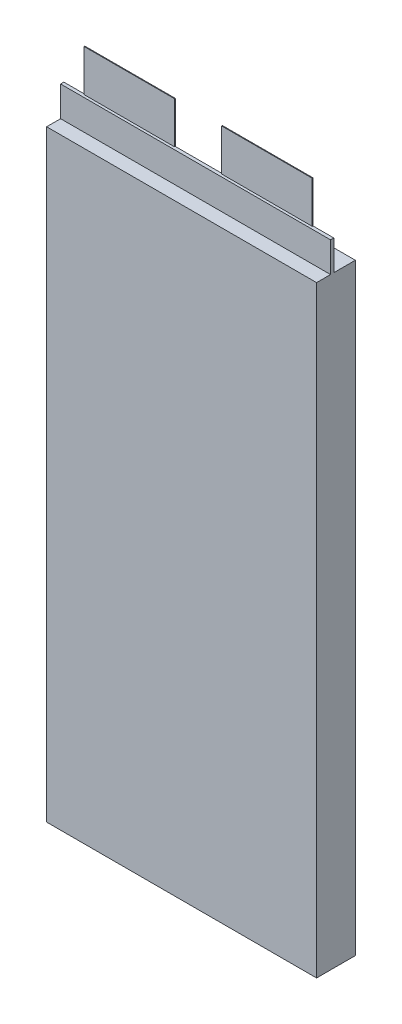
ISO-10303-21;
HEADER;
FILE_DESCRIPTION(('STEP AP214'),'2;1');
FILE_NAME('part.step','',(''),(''),'','','');
FILE_SCHEMA(('AUTOMOTIVE_DESIGN { 1 0 10303 214 1 1 1 1 }'));
ENDSEC;
DATA;
#1=APPLICATION_CONTEXT('core data for automotive mechanical design processes');
#2=APPLICATION_PROTOCOL_DEFINITION('international standard','automotive_design',2000,#1);
#3=PRODUCT_CONTEXT('',#1,'mechanical');
#4=PRODUCT('Part','Part','',(#3));
#5=PRODUCT_RELATED_PRODUCT_CATEGORY('part','',(#4));
#6=PRODUCT_DEFINITION_FORMATION('','',#4);
#7=PRODUCT_DEFINITION_CONTEXT('part definition',#1,'design');
#8=PRODUCT_DEFINITION('design','',#6,#7);
#9=PRODUCT_DEFINITION_SHAPE('','',#8);
#10=(LENGTH_UNIT() NAMED_UNIT(*) SI_UNIT(.MILLI.,.METRE.));
#11=(NAMED_UNIT(*) PLANE_ANGLE_UNIT() SI_UNIT($,.RADIAN.));
#12=(NAMED_UNIT(*) SI_UNIT($,.STERADIAN.) SOLID_ANGLE_UNIT());
#13=UNCERTAINTY_MEASURE_WITH_UNIT(LENGTH_MEASURE(1.E-05),#10,'distance_accuracy_value','');
#14=(GEOMETRIC_REPRESENTATION_CONTEXT(3) GLOBAL_UNCERTAINTY_ASSIGNED_CONTEXT((#13)) GLOBAL_UNIT_ASSIGNED_CONTEXT((#10,
#11,#12)) REPRESENTATION_CONTEXT('',''));
#15=CARTESIAN_POINT('',(0.,0.,0.));
#16=DIRECTION('',(0.,0.,1.));
#17=DIRECTION('',(1.,0.,0.));
#18=AXIS2_PLACEMENT_3D('',#15,#16,#17);
#19=CARTESIAN_POINT('',(0.,174.5,6.15));
#20=DIRECTION('',(0.,1.,0.));
#21=DIRECTION('',(0.,0.,1.));
#22=AXIS2_PLACEMENT_3D('',#19,#20,#21);
#23=PLANE('',#22);
#24=DIRECTION('',(1.,0.,0.));
#25=VECTOR('',#24,1.);
#26=CARTESIAN_POINT('',(0.,174.5,5.95));
#27=LINE('',#26,#25);
#28=CARTESIAN_POINT('',(6.49999999999999,174.5,5.95));
#29=VERTEX_POINT('',#28);
#30=CARTESIAN_POINT('',(31.5,174.5,5.95));
#31=VERTEX_POINT('',#30);
#32=EDGE_CURVE('E109',#29,#31,#27,.T.);
#33=ORIENTED_EDGE('',*,*,#32,.T.);
#34=DIRECTION('',(0.,0.,-1.));
#35=VECTOR('',#34,1.);
#36=CARTESIAN_POINT('',(31.5,174.5,6.15));
#37=LINE('',#36,#35);
#38=CARTESIAN_POINT('',(31.5,174.5,6.15));
#39=VERTEX_POINT('',#38);
#40=EDGE_CURVE('E12',#39,#31,#37,.T.);
#41=ORIENTED_EDGE('',*,*,#40,.F.);
#42=DIRECTION('',(1.,0.,0.));
#43=VECTOR('',#42,1.);
#44=CARTESIAN_POINT('',(0.,174.5,6.15));
#45=LINE('',#44,#43);
#46=CARTESIAN_POINT('',(6.49999999999999,174.5,6.15));
#47=VERTEX_POINT('',#46);
#48=EDGE_CURVE('E95',#47,#39,#45,.T.);
#49=ORIENTED_EDGE('',*,*,#48,.F.);
#50=DIRECTION('',(0.,0.,-1.));
#51=VECTOR('',#50,1.);
#52=CARTESIAN_POINT('',(6.49999999999999,174.5,6.15));
#53=LINE('',#52,#51);
#54=EDGE_CURVE('E62',#47,#29,#53,.T.);
#55=ORIENTED_EDGE('',*,*,#54,.T.);
#56=EDGE_LOOP('',(#33,#41,#49,#55));
#57=FACE_BOUND('',#56,.T.);
#58=ADVANCED_FACE('F46',(#57),#23,.F.);
#59=CARTESIAN_POINT('',(31.5000000000001,0.,6.15));
#60=DIRECTION('',(-1.,0.,0.));
#61=DIRECTION('',(0.,-1.,0.));
#62=AXIS2_PLACEMENT_3D('',#59,#60,#61);
#63=PLANE('',#62);
#64=DIRECTION('',(0.,1.,0.));
#65=VECTOR('',#64,1.);
#66=CARTESIAN_POINT('',(31.5000000000001,0.,5.95));
#67=LINE('',#66,#65);
#68=CARTESIAN_POINT('',(31.5,186.,5.95));
#69=VERTEX_POINT('',#68);
#70=EDGE_CURVE('E100',#31,#69,#67,.T.);
#71=ORIENTED_EDGE('',*,*,#70,.T.);
#72=DIRECTION('',(0.,0.,-1.));
#73=VECTOR('',#72,1.);
#74=CARTESIAN_POINT('',(31.5,186.,6.15));
#75=LINE('',#74,#73);
#76=CARTESIAN_POINT('',(31.5,186.,6.15));
#77=VERTEX_POINT('',#76);
#78=EDGE_CURVE('E54',#77,#69,#75,.T.);
#79=ORIENTED_EDGE('',*,*,#78,.F.);
#80=DIRECTION('',(0.,1.,0.));
#81=VECTOR('',#80,1.);
#82=CARTESIAN_POINT('',(31.5000000000001,0.,6.15));
#83=LINE('',#82,#81);
#84=EDGE_CURVE('E87',#39,#77,#83,.T.);
#85=ORIENTED_EDGE('',*,*,#84,.F.);
#86=ORIENTED_EDGE('',*,*,#40,.T.);
#87=EDGE_LOOP('',(#71,#79,#85,#86));
#88=FACE_BOUND('',#87,.T.);
#89=ADVANCED_FACE('F99',(#88),#63,.F.);
#90=CARTESIAN_POINT('',(0.,186.,6.15));
#91=DIRECTION('',(0.,1.,0.));
#92=DIRECTION('',(0.,0.,1.));
#93=AXIS2_PLACEMENT_3D('',#90,#91,#92);
#94=PLANE('',#93);
#95=DIRECTION('',(1.,0.,0.));
#96=VECTOR('',#95,1.);
#97=CARTESIAN_POINT('',(0.,186.,5.95));
#98=LINE('',#97,#96);
#99=CARTESIAN_POINT('',(6.49999999999999,186.,5.95));
#100=VERTEX_POINT('',#99);
#101=EDGE_CURVE('E112',#100,#69,#98,.T.);
#102=ORIENTED_EDGE('',*,*,#101,.F.);
#103=DIRECTION('',(0.,0.,-1.));
#104=VECTOR('',#103,1.);
#105=CARTESIAN_POINT('',(6.49999999999999,186.,6.15));
#106=LINE('',#105,#104);
#107=CARTESIAN_POINT('',(6.49999999999999,186.,6.15));
#108=VERTEX_POINT('',#107);
#109=EDGE_CURVE('E76',#108,#100,#106,.T.);
#110=ORIENTED_EDGE('',*,*,#109,.F.);
#111=DIRECTION('',(1.,0.,0.));
#112=VECTOR('',#111,1.);
#113=CARTESIAN_POINT('',(0.,186.,6.15));
#114=LINE('',#113,#112);
#115=EDGE_CURVE('E94',#108,#77,#114,.T.);
#116=ORIENTED_EDGE('',*,*,#115,.T.);
#117=ORIENTED_EDGE('',*,*,#78,.T.);
#118=EDGE_LOOP('',(#102,#110,#116,#117));
#119=FACE_BOUND('',#118,.T.);
#120=ADVANCED_FACE('F103',(#119),#94,.T.);
#121=CARTESIAN_POINT('',(6.49999999999992,0.,6.15));
#122=DIRECTION('',(-1.,0.,0.));
#123=DIRECTION('',(0.,-1.,0.));
#124=AXIS2_PLACEMENT_3D('',#121,#122,#123);
#125=PLANE('',#124);
#126=DIRECTION('',(0.,1.,0.));
#127=VECTOR('',#126,1.);
#128=CARTESIAN_POINT('',(6.49999999999992,0.,5.95));
#129=LINE('',#128,#127);
#130=EDGE_CURVE('E114',#29,#100,#129,.T.);
#131=ORIENTED_EDGE('',*,*,#130,.F.);
#132=ORIENTED_EDGE('',*,*,#54,.F.);
#133=DIRECTION('',(0.,1.,0.));
#134=VECTOR('',#133,1.);
#135=CARTESIAN_POINT('',(6.49999999999992,0.,6.15));
#136=LINE('',#135,#134);
#137=EDGE_CURVE('E104',#47,#108,#136,.T.);
#138=ORIENTED_EDGE('',*,*,#137,.T.);
#139=ORIENTED_EDGE('',*,*,#109,.T.);
#140=EDGE_LOOP('',(#131,#132,#138,#139));
#141=FACE_BOUND('',#140,.T.);
#142=ADVANCED_FACE('F120',(#141),#125,.T.);
#143=CARTESIAN_POINT('',(0.,0.,6.15));
#144=DIRECTION('',(0.,0.,1.));
#145=DIRECTION('',(1.,0.,0.));
#146=AXIS2_PLACEMENT_3D('',#143,#144,#145);
#147=PLANE('',#146);
#148=ORIENTED_EDGE('',*,*,#48,.T.);
#149=ORIENTED_EDGE('',*,*,#84,.T.);
#150=ORIENTED_EDGE('',*,*,#115,.F.);
#151=ORIENTED_EDGE('',*,*,#137,.F.);
#152=EDGE_LOOP('',(#148,#149,#150,#151));
#153=FACE_BOUND('',#152,.T.);
#154=ADVANCED_FACE('F91',(#153),#147,.T.);
#155=CARTESIAN_POINT('',(0.,0.,5.95));
#156=DIRECTION('',(0.,0.,1.));
#157=DIRECTION('',(1.,0.,0.));
#158=AXIS2_PLACEMENT_3D('',#155,#156,#157);
#159=PLANE('',#158);
#160=ORIENTED_EDGE('',*,*,#32,.F.);
#161=ORIENTED_EDGE('',*,*,#130,.T.);
#162=ORIENTED_EDGE('',*,*,#101,.T.);
#163=ORIENTED_EDGE('',*,*,#70,.F.);
#164=EDGE_LOOP('',(#160,#161,#162,#163));
#165=FACE_BOUND('',#164,.T.);
#166=ADVANCED_FACE('F119',(#165),#159,.F.);
#167=CLOSED_SHELL('',(#58,#89,#120,#142,#154,#166));
#168=MANIFOLD_SOLID_BREP('B2',#167);
#169=CARTESIAN_POINT('',(0.,174.5,6.15));
#170=DIRECTION('',(0.,1.,0.));
#171=DIRECTION('',(0.,0.,1.));
#172=AXIS2_PLACEMENT_3D('',#169,#170,#171);
#173=PLANE('',#172);
#174=DIRECTION('',(1.,0.,0.));
#175=VECTOR('',#174,1.);
#176=CARTESIAN_POINT('',(0.,174.5,5.95));
#177=LINE('',#176,#175);
#178=CARTESIAN_POINT('',(-31.5,174.5,5.95));
#179=VERTEX_POINT('',#178);
#180=CARTESIAN_POINT('',(-6.5,174.5,5.95));
#181=VERTEX_POINT('',#180);
#182=EDGE_CURVE('E242',#179,#181,#177,.T.);
#183=ORIENTED_EDGE('',*,*,#182,.T.);
#184=DIRECTION('',(0.,0.,-1.));
#185=VECTOR('',#184,1.);
#186=CARTESIAN_POINT('',(-6.5,174.5,6.15));
#187=LINE('',#186,#185);
#188=CARTESIAN_POINT('',(-6.5,174.5,6.15));
#189=VERTEX_POINT('',#188);
#190=EDGE_CURVE('E44',#189,#181,#187,.T.);
#191=ORIENTED_EDGE('',*,*,#190,.F.);
#192=DIRECTION('',(1.,0.,0.));
#193=VECTOR('',#192,1.);
#194=CARTESIAN_POINT('',(0.,174.5,6.15));
#195=LINE('',#194,#193);
#196=CARTESIAN_POINT('',(-31.5,174.5,6.15));
#197=VERTEX_POINT('',#196);
#198=EDGE_CURVE('E228',#197,#189,#195,.T.);
#199=ORIENTED_EDGE('',*,*,#198,.F.);
#200=DIRECTION('',(0.,0.,-1.));
#201=VECTOR('',#200,1.);
#202=CARTESIAN_POINT('',(-31.5,174.5,6.15));
#203=LINE('',#202,#201);
#204=EDGE_CURVE('E195',#197,#179,#203,.T.);
#205=ORIENTED_EDGE('',*,*,#204,.T.);
#206=EDGE_LOOP('',(#183,#191,#199,#205));
#207=FACE_BOUND('',#206,.T.);
#208=ADVANCED_FACE('F179',(#207),#173,.F.);
#209=CARTESIAN_POINT('',(-6.49999999999995,0.,6.15));
#210=DIRECTION('',(-1.,0.,0.));
#211=DIRECTION('',(0.,-1.,0.));
#212=AXIS2_PLACEMENT_3D('',#209,#210,#211);
#213=PLANE('',#212);
#214=DIRECTION('',(0.,1.,0.));
#215=VECTOR('',#214,1.);
#216=CARTESIAN_POINT('',(-6.49999999999995,0.,5.95));
#217=LINE('',#216,#215);
#218=CARTESIAN_POINT('',(-6.50000000000001,186.,5.95));
#219=VERTEX_POINT('',#218);
#220=EDGE_CURVE('E233',#181,#219,#217,.T.);
#221=ORIENTED_EDGE('',*,*,#220,.T.);
#222=DIRECTION('',(0.,0.,-1.));
#223=VECTOR('',#222,1.);
#224=CARTESIAN_POINT('',(-6.50000000000001,186.,6.15));
#225=LINE('',#224,#223);
#226=CARTESIAN_POINT('',(-6.50000000000001,186.,6.15));
#227=VERTEX_POINT('',#226);
#228=EDGE_CURVE('E187',#227,#219,#225,.T.);
#229=ORIENTED_EDGE('',*,*,#228,.F.);
#230=DIRECTION('',(0.,1.,0.));
#231=VECTOR('',#230,1.);
#232=CARTESIAN_POINT('',(-6.49999999999995,0.,6.15));
#233=LINE('',#232,#231);
#234=EDGE_CURVE('E220',#189,#227,#233,.T.);
#235=ORIENTED_EDGE('',*,*,#234,.F.);
#236=ORIENTED_EDGE('',*,*,#190,.T.);
#237=EDGE_LOOP('',(#221,#229,#235,#236));
#238=FACE_BOUND('',#237,.T.);
#239=ADVANCED_FACE('F232',(#238),#213,.F.);
#240=CARTESIAN_POINT('',(0.,186.,6.15));
#241=DIRECTION('',(0.,1.,0.));
#242=DIRECTION('',(0.,0.,1.));
#243=AXIS2_PLACEMENT_3D('',#240,#241,#242);
#244=PLANE('',#243);
#245=DIRECTION('',(1.,0.,0.));
#246=VECTOR('',#245,1.);
#247=CARTESIAN_POINT('',(0.,186.,5.95));
#248=LINE('',#247,#246);
#249=CARTESIAN_POINT('',(-31.5,186.,5.95));
#250=VERTEX_POINT('',#249);
#251=EDGE_CURVE('E245',#250,#219,#248,.T.);
#252=ORIENTED_EDGE('',*,*,#251,.F.);
#253=DIRECTION('',(0.,0.,-1.));
#254=VECTOR('',#253,1.);
#255=CARTESIAN_POINT('',(-31.5,186.,6.15));
#256=LINE('',#255,#254);
#257=CARTESIAN_POINT('',(-31.5,186.,6.15));
#258=VERTEX_POINT('',#257);
#259=EDGE_CURVE('E209',#258,#250,#256,.T.);
#260=ORIENTED_EDGE('',*,*,#259,.F.);
#261=DIRECTION('',(1.,0.,0.));
#262=VECTOR('',#261,1.);
#263=CARTESIAN_POINT('',(0.,186.,6.15));
#264=LINE('',#263,#262);
#265=EDGE_CURVE('E227',#258,#227,#264,.T.);
#266=ORIENTED_EDGE('',*,*,#265,.T.);
#267=ORIENTED_EDGE('',*,*,#228,.T.);
#268=EDGE_LOOP('',(#252,#260,#266,#267));
#269=FACE_BOUND('',#268,.T.);
#270=ADVANCED_FACE('F236',(#269),#244,.T.);
#271=CARTESIAN_POINT('',(-31.5,0.,6.15));
#272=DIRECTION('',(-1.,0.,0.));
#273=DIRECTION('',(0.,0.,1.));
#274=AXIS2_PLACEMENT_3D('',#271,#272,#273);
#275=PLANE('',#274);
#276=DIRECTION('',(0.,1.,0.));
#277=VECTOR('',#276,1.);
#278=CARTESIAN_POINT('',(-31.5,0.,5.95));
#279=LINE('',#278,#277);
#280=EDGE_CURVE('E247',#179,#250,#279,.T.);
#281=ORIENTED_EDGE('',*,*,#280,.F.);
#282=ORIENTED_EDGE('',*,*,#204,.F.);
#283=DIRECTION('',(0.,1.,0.));
#284=VECTOR('',#283,1.);
#285=CARTESIAN_POINT('',(-31.5,0.,6.15));
#286=LINE('',#285,#284);
#287=EDGE_CURVE('E237',#197,#258,#286,.T.);
#288=ORIENTED_EDGE('',*,*,#287,.T.);
#289=ORIENTED_EDGE('',*,*,#259,.T.);
#290=EDGE_LOOP('',(#281,#282,#288,#289));
#291=FACE_BOUND('',#290,.T.);
#292=ADVANCED_FACE('F253',(#291),#275,.T.);
#293=CARTESIAN_POINT('',(0.,0.,6.15));
#294=DIRECTION('',(0.,0.,1.));
#295=DIRECTION('',(1.,0.,0.));
#296=AXIS2_PLACEMENT_3D('',#293,#294,#295);
#297=PLANE('',#296);
#298=ORIENTED_EDGE('',*,*,#198,.T.);
#299=ORIENTED_EDGE('',*,*,#234,.T.);
#300=ORIENTED_EDGE('',*,*,#265,.F.);
#301=ORIENTED_EDGE('',*,*,#287,.F.);
#302=EDGE_LOOP('',(#298,#299,#300,#301));
#303=FACE_BOUND('',#302,.T.);
#304=ADVANCED_FACE('F224',(#303),#297,.T.);
#305=CARTESIAN_POINT('',(0.,0.,5.95));
#306=DIRECTION('',(0.,0.,1.));
#307=DIRECTION('',(1.,0.,0.));
#308=AXIS2_PLACEMENT_3D('',#305,#306,#307);
#309=PLANE('',#308);
#310=ORIENTED_EDGE('',*,*,#182,.F.);
#311=ORIENTED_EDGE('',*,*,#280,.T.);
#312=ORIENTED_EDGE('',*,*,#251,.T.);
#313=ORIENTED_EDGE('',*,*,#220,.F.);
#314=EDGE_LOOP('',(#310,#311,#312,#313));
#315=FACE_BOUND('',#314,.T.);
#316=ADVANCED_FACE('F252',(#315),#309,.F.);
#317=CLOSED_SHELL('',(#208,#239,#270,#292,#304,#316));
#318=MANIFOLD_SOLID_BREP('B6',#317);
#319=CARTESIAN_POINT('',(-37.25,166.2,10.7));
#320=DIRECTION('',(0.,-1.,0.));
#321=DIRECTION('',(1.,0.,0.));
#322=AXIS2_PLACEMENT_3D('',#319,#320,#321);
#323=PLANE('',#322);
#324=DIRECTION('',(1.,0.,0.));
#325=VECTOR('',#324,1.);
#326=CARTESIAN_POINT('',(-37.25,166.2,6.85));
#327=LINE('',#326,#325);
#328=CARTESIAN_POINT('',(-37.25,166.2,6.85));
#329=VERTEX_POINT('',#328);
#330=CARTESIAN_POINT('',(37.2499999999999,166.2,6.85));
#331=VERTEX_POINT('',#330);
#332=EDGE_CURVE('E369',#329,#331,#327,.T.);
#333=ORIENTED_EDGE('',*,*,#332,.F.);
#334=DIRECTION('',(0.,0.,-1.));
#335=VECTOR('',#334,1.);
#336=CARTESIAN_POINT('',(-37.25,166.2,10.7));
#337=LINE('',#336,#335);
#338=CARTESIAN_POINT('',(-37.25,166.2,10.7));
#339=VERTEX_POINT('',#338);
#340=EDGE_CURVE('E424',#339,#329,#337,.T.);
#341=ORIENTED_EDGE('',*,*,#340,.F.);
#342=DIRECTION('',(-1.,0.,0.));
#343=VECTOR('',#342,1.);
#344=CARTESIAN_POINT('',(-37.25,166.2,10.7));
#345=LINE('',#344,#343);
#346=CARTESIAN_POINT('',(37.2499999999999,166.2,10.7));
#347=VERTEX_POINT('',#346);
#348=EDGE_CURVE('E371',#347,#339,#345,.T.);
#349=ORIENTED_EDGE('',*,*,#348,.F.);
#350=DIRECTION('',(0.,0.,-1.));
#351=VECTOR('',#350,1.);
#352=CARTESIAN_POINT('',(37.2499999999999,166.2,10.7));
#353=LINE('',#352,#351);
#354=EDGE_CURVE('E366',#347,#331,#353,.T.);
#355=ORIENTED_EDGE('',*,*,#354,.T.);
#356=EDGE_LOOP('',(#333,#341,#349,#355));
#357=FACE_BOUND('',#356,.T.);
#358=ADVANCED_FACE('F303',(#357),#323,.F.);
#359=CARTESIAN_POINT('',(-37.25,0.,10.7));
#360=DIRECTION('',(1.,0.,0.));
#361=DIRECTION('',(0.,0.,-1.));
#362=AXIS2_PLACEMENT_3D('',#359,#360,#361);
#363=PLANE('',#362);
#364=DIRECTION('',(0.,-1.,0.));
#365=VECTOR('',#364,1.);
#366=CARTESIAN_POINT('',(-37.25,0.,0.));
#367=LINE('',#366,#365);
#368=CARTESIAN_POINT('',(-37.25,166.2,0.));
#369=VERTEX_POINT('',#368);
#370=CARTESIAN_POINT('',(-37.25,0.,0.));
#371=VERTEX_POINT('',#370);
#372=EDGE_CURVE('E407',#369,#371,#367,.T.);
#373=ORIENTED_EDGE('',*,*,#372,.T.);
#374=DIRECTION('',(0.,0.,-1.));
#375=VECTOR('',#374,1.);
#376=CARTESIAN_POINT('',(-37.25,0.,10.7));
#377=LINE('',#376,#375);
#378=CARTESIAN_POINT('',(-37.25,0.,10.7));
#379=VERTEX_POINT('',#378);
#380=EDGE_CURVE('E177',#379,#371,#377,.T.);
#381=ORIENTED_EDGE('',*,*,#380,.F.);
#382=DIRECTION('',(0.,-1.,0.));
#383=VECTOR('',#382,1.);
#384=CARTESIAN_POINT('',(-37.25,0.,10.7));
#385=LINE('',#384,#383);
#386=EDGE_CURVE('E408',#339,#379,#385,.T.);
#387=ORIENTED_EDGE('',*,*,#386,.F.);
#388=ORIENTED_EDGE('',*,*,#340,.T.);
#389=DIRECTION('',(0.,-1.,0.));
#390=VECTOR('',#389,1.);
#391=CARTESIAN_POINT('',(-37.25,166.2,6.85));
#392=LINE('',#391,#390);
#393=CARTESIAN_POINT('',(-37.25,174.5,6.85));
#394=VERTEX_POINT('',#393);
#395=EDGE_CURVE('E383',#394,#329,#392,.T.);
#396=ORIENTED_EDGE('',*,*,#395,.F.);
#397=DIRECTION('',(0.,0.,-1.));
#398=VECTOR('',#397,1.);
#399=CARTESIAN_POINT('',(-37.25,174.5,6.85));
#400=LINE('',#399,#398);
#401=CARTESIAN_POINT('',(-37.25,174.5,5.95));
#402=VERTEX_POINT('',#401);
#403=EDGE_CURVE('E392',#394,#402,#400,.T.);
#404=ORIENTED_EDGE('',*,*,#403,.T.);
#405=DIRECTION('',(0.,-1.,0.));
#406=VECTOR('',#405,1.);
#407=CARTESIAN_POINT('',(-37.25,166.2,5.95));
#408=LINE('',#407,#406);
#409=CARTESIAN_POINT('',(-37.25,166.2,5.95));
#410=VERTEX_POINT('',#409);
#411=EDGE_CURVE('E396',#402,#410,#408,.T.);
#412=ORIENTED_EDGE('',*,*,#411,.T.);
#413=EDGE_CURVE('E323',#410,#369,#337,.T.);
#414=ORIENTED_EDGE('',*,*,#413,.T.);
#415=EDGE_LOOP('',(#373,#381,#387,#388,#396,#404,#412,#414));
#416=FACE_BOUND('',#415,.T.);
#417=ADVANCED_FACE('F305',(#416),#363,.F.);
#418=CARTESIAN_POINT('',(-37.25,0.,10.7));
#419=DIRECTION('',(0.,1.,0.));
#420=DIRECTION('',(-1.,0.,0.));
#421=AXIS2_PLACEMENT_3D('',#418,#419,#420);
#422=PLANE('',#421);
#423=DIRECTION('',(1.,0.,0.));
#424=VECTOR('',#423,1.);
#425=CARTESIAN_POINT('',(-37.25,0.,0.));
#426=LINE('',#425,#424);
#427=CARTESIAN_POINT('',(37.25,0.,0.));
#428=VERTEX_POINT('',#427);
#429=EDGE_CURVE('E419',#371,#428,#426,.T.);
#430=ORIENTED_EDGE('',*,*,#429,.T.);
#431=DIRECTION('',(0.,0.,-1.));
#432=VECTOR('',#431,1.);
#433=CARTESIAN_POINT('',(37.25,0.,10.7));
#434=LINE('',#433,#432);
#435=CARTESIAN_POINT('',(37.25,0.,10.7));
#436=VERTEX_POINT('',#435);
#437=EDGE_CURVE('E311',#436,#428,#434,.T.);
#438=ORIENTED_EDGE('',*,*,#437,.F.);
#439=DIRECTION('',(1.,0.,0.));
#440=VECTOR('',#439,1.);
#441=CARTESIAN_POINT('',(-37.25,0.,10.7));
#442=LINE('',#441,#440);
#443=EDGE_CURVE('E411',#379,#436,#442,.T.);
#444=ORIENTED_EDGE('',*,*,#443,.F.);
#445=ORIENTED_EDGE('',*,*,#380,.T.);
#446=EDGE_LOOP('',(#430,#438,#444,#445));
#447=FACE_BOUND('',#446,.T.);
#448=ADVANCED_FACE('F447',(#447),#422,.F.);
#449=CARTESIAN_POINT('',(37.25,0.,10.7));
#450=DIRECTION('',(-1.,0.,0.));
#451=DIRECTION('',(0.,-1.,0.));
#452=AXIS2_PLACEMENT_3D('',#449,#450,#451);
#453=PLANE('',#452);
#454=DIRECTION('',(0.,1.,0.));
#455=VECTOR('',#454,1.);
#456=CARTESIAN_POINT('',(37.25,0.,0.));
#457=LINE('',#456,#455);
#458=CARTESIAN_POINT('',(37.2499999999999,166.2,0.));
#459=VERTEX_POINT('',#458);
#460=EDGE_CURVE('E421',#428,#459,#457,.T.);
#461=ORIENTED_EDGE('',*,*,#460,.T.);
#462=CARTESIAN_POINT('',(37.2499999999999,166.2,5.95));
#463=VERTEX_POINT('',#462);
#464=EDGE_CURVE('E375',#463,#459,#353,.T.);
#465=ORIENTED_EDGE('',*,*,#464,.F.);
#466=DIRECTION('',(0.,1.,0.));
#467=VECTOR('',#466,1.);
#468=CARTESIAN_POINT('',(37.2499999999999,166.2,5.95));
#469=LINE('',#468,#467);
#470=CARTESIAN_POINT('',(37.25,174.5,5.95));
#471=VERTEX_POINT('',#470);
#472=EDGE_CURVE('E400',#463,#471,#469,.T.);
#473=ORIENTED_EDGE('',*,*,#472,.T.);
#474=DIRECTION('',(0.,0.,-1.));
#475=VECTOR('',#474,1.);
#476=CARTESIAN_POINT('',(37.25,174.5,6.85));
#477=LINE('',#476,#475);
#478=CARTESIAN_POINT('',(37.25,174.5,6.85));
#479=VERTEX_POINT('',#478);
#480=EDGE_CURVE('E388',#479,#471,#477,.T.);
#481=ORIENTED_EDGE('',*,*,#480,.F.);
#482=DIRECTION('',(0.,1.,0.));
#483=VECTOR('',#482,1.);
#484=CARTESIAN_POINT('',(37.2499999999999,166.2,6.85));
#485=LINE('',#484,#483);
#486=EDGE_CURVE('E380',#331,#479,#485,.T.);
#487=ORIENTED_EDGE('',*,*,#486,.F.);
#488=ORIENTED_EDGE('',*,*,#354,.F.);
#489=DIRECTION('',(0.,1.,0.));
#490=VECTOR('',#489,1.);
#491=CARTESIAN_POINT('',(37.25,0.,10.7));
#492=LINE('',#491,#490);
#493=EDGE_CURVE('E414',#436,#347,#492,.T.);
#494=ORIENTED_EDGE('',*,*,#493,.F.);
#495=ORIENTED_EDGE('',*,*,#437,.T.);
#496=EDGE_LOOP('',(#461,#465,#473,#481,#487,#488,#494,#495));
#497=FACE_BOUND('',#496,.T.);
#498=ADVANCED_FACE('F386',(#497),#453,.F.);
#499=ORIENTED_EDGE('',*,*,#413,.F.);
#500=DIRECTION('',(1.,0.,0.));
#501=VECTOR('',#500,1.);
#502=CARTESIAN_POINT('',(-37.25,166.2,5.95));
#503=LINE('',#502,#501);
#504=EDGE_CURVE('E318',#410,#463,#503,.T.);
#505=ORIENTED_EDGE('',*,*,#504,.T.);
#506=ORIENTED_EDGE('',*,*,#464,.T.);
#507=DIRECTION('',(-1.,0.,0.));
#508=VECTOR('',#507,1.);
#509=CARTESIAN_POINT('',(-37.25,166.2,0.));
#510=LINE('',#509,#508);
#511=EDGE_CURVE('E412',#459,#369,#510,.T.);
#512=ORIENTED_EDGE('',*,*,#511,.T.);
#513=EDGE_LOOP('',(#499,#505,#506,#512));
#514=FACE_BOUND('',#513,.T.);
#515=ADVANCED_FACE('F433',(#514),#323,.F.);
#516=CARTESIAN_POINT('',(0.,0.,10.7));
#517=DIRECTION('',(0.,0.,-1.));
#518=DIRECTION('',(-1.,0.,0.));
#519=AXIS2_PLACEMENT_3D('',#516,#517,#518);
#520=PLANE('',#519);
#521=ORIENTED_EDGE('',*,*,#386,.T.);
#522=ORIENTED_EDGE('',*,*,#443,.T.);
#523=ORIENTED_EDGE('',*,*,#493,.T.);
#524=ORIENTED_EDGE('',*,*,#348,.T.);
#525=EDGE_LOOP('',(#521,#522,#523,#524));
#526=FACE_BOUND('',#525,.T.);
#527=ADVANCED_FACE('F446',(#526),#520,.F.);
#528=CARTESIAN_POINT('',(0.,0.,0.));
#529=DIRECTION('',(0.,0.,-1.));
#530=DIRECTION('',(-1.,0.,0.));
#531=AXIS2_PLACEMENT_3D('',#528,#529,#530);
#532=PLANE('',#531);
#533=ORIENTED_EDGE('',*,*,#372,.F.);
#534=ORIENTED_EDGE('',*,*,#511,.F.);
#535=ORIENTED_EDGE('',*,*,#460,.F.);
#536=ORIENTED_EDGE('',*,*,#429,.F.);
#537=EDGE_LOOP('',(#533,#534,#535,#536));
#538=FACE_BOUND('',#537,.T.);
#539=ADVANCED_FACE('F432',(#538),#532,.T.);
#540=CARTESIAN_POINT('',(-37.25,174.5,6.85));
#541=DIRECTION('',(0.,-1.,0.));
#542=DIRECTION('',(0.,0.,-1.));
#543=AXIS2_PLACEMENT_3D('',#540,#541,#542);
#544=PLANE('',#543);
#545=DIRECTION('',(-1.,0.,0.));
#546=VECTOR('',#545,1.);
#547=CARTESIAN_POINT('',(-37.25,174.5,5.95));
#548=LINE('',#547,#546);
#549=EDGE_CURVE('E402',#471,#402,#548,.T.);
#550=ORIENTED_EDGE('',*,*,#549,.T.);
#551=ORIENTED_EDGE('',*,*,#403,.F.);
#552=DIRECTION('',(-1.,0.,0.));
#553=VECTOR('',#552,1.);
#554=CARTESIAN_POINT('',(-37.25,174.5,6.85));
#555=LINE('',#554,#553);
#556=EDGE_CURVE('E390',#479,#394,#555,.T.);
#557=ORIENTED_EDGE('',*,*,#556,.F.);
#558=ORIENTED_EDGE('',*,*,#480,.T.);
#559=EDGE_LOOP('',(#550,#551,#557,#558));
#560=FACE_BOUND('',#559,.T.);
#561=ADVANCED_FACE('F441',(#560),#544,.F.);
#562=CARTESIAN_POINT('',(0.,0.,6.85));
#563=DIRECTION('',(0.,0.,-1.));
#564=DIRECTION('',(-1.,0.,0.));
#565=AXIS2_PLACEMENT_3D('',#562,#563,#564);
#566=PLANE('',#565);
#567=ORIENTED_EDGE('',*,*,#395,.T.);
#568=ORIENTED_EDGE('',*,*,#332,.T.);
#569=ORIENTED_EDGE('',*,*,#486,.T.);
#570=ORIENTED_EDGE('',*,*,#556,.T.);
#571=EDGE_LOOP('',(#567,#568,#569,#570));
#572=FACE_BOUND('',#571,.T.);
#573=ADVANCED_FACE('F379',(#572),#566,.F.);
#574=CARTESIAN_POINT('',(0.,0.,5.95));
#575=DIRECTION('',(0.,0.,-1.));
#576=DIRECTION('',(-1.,0.,0.));
#577=AXIS2_PLACEMENT_3D('',#574,#575,#576);
#578=PLANE('',#577);
#579=ORIENTED_EDGE('',*,*,#411,.F.);
#580=ORIENTED_EDGE('',*,*,#549,.F.);
#581=ORIENTED_EDGE('',*,*,#472,.F.);
#582=ORIENTED_EDGE('',*,*,#504,.F.);
#583=EDGE_LOOP('',(#579,#580,#581,#582));
#584=FACE_BOUND('',#583,.T.);
#585=ADVANCED_FACE('F438',(#584),#578,.T.);
#586=CLOSED_SHELL('',(#358,#417,#448,#498,#515,#527,#539,#561,#573,#585));
#587=MANIFOLD_SOLID_BREP('B38',#586);
#588=ADVANCED_BREP_SHAPE_REPRESENTATION('',(#18,#168,#318,#587),#14);
#589=SHAPE_DEFINITION_REPRESENTATION(#9,#588);
ENDSEC;
END-ISO-10303-21;
